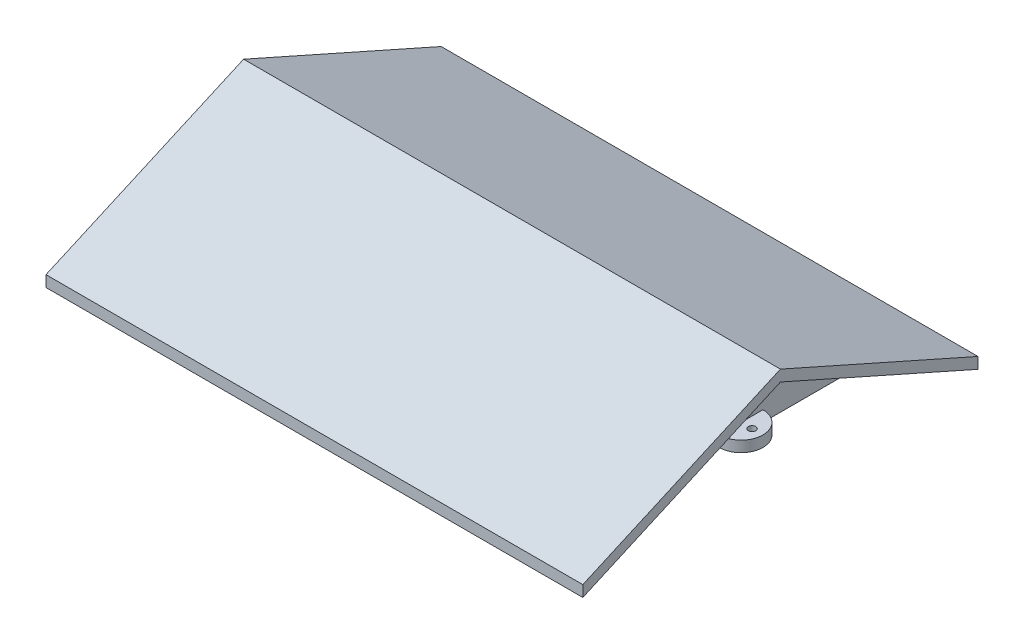
ISO-10303-21;
HEADER;
FILE_DESCRIPTION(('STEP AP214'),'2;1');
FILE_NAME('part.step','',(''),(''),'','','');
FILE_SCHEMA(('AUTOMOTIVE_DESIGN { 1 0 10303 214 1 1 1 1 }'));
ENDSEC;
DATA;
#1=APPLICATION_CONTEXT('core data for automotive mechanical design processes');
#2=APPLICATION_PROTOCOL_DEFINITION('international standard','automotive_design',2000,#1);
#3=PRODUCT_CONTEXT('',#1,'mechanical');
#4=PRODUCT('Part','Part','',(#3));
#5=PRODUCT_RELATED_PRODUCT_CATEGORY('part','',(#4));
#6=PRODUCT_DEFINITION_FORMATION('','',#4);
#7=PRODUCT_DEFINITION_CONTEXT('part definition',#1,'design');
#8=PRODUCT_DEFINITION('design','',#6,#7);
#9=PRODUCT_DEFINITION_SHAPE('','',#8);
#10=(LENGTH_UNIT() NAMED_UNIT(*) SI_UNIT(.MILLI.,.METRE.));
#11=(NAMED_UNIT(*) PLANE_ANGLE_UNIT() SI_UNIT($,.RADIAN.));
#12=(NAMED_UNIT(*) SI_UNIT($,.STERADIAN.) SOLID_ANGLE_UNIT());
#13=UNCERTAINTY_MEASURE_WITH_UNIT(LENGTH_MEASURE(1.E-05),#10,'distance_accuracy_value','');
#14=(GEOMETRIC_REPRESENTATION_CONTEXT(3) GLOBAL_UNCERTAINTY_ASSIGNED_CONTEXT((#13)) GLOBAL_UNIT_ASSIGNED_CONTEXT((#10,
#11,#12)) REPRESENTATION_CONTEXT('',''));
#15=CARTESIAN_POINT('',(0.,0.,0.));
#16=DIRECTION('',(0.,0.,1.));
#17=DIRECTION('',(1.,0.,0.));
#18=AXIS2_PLACEMENT_3D('',#15,#16,#17);
#19=CARTESIAN_POINT('',(0.0001,4.27585831422593,1.9003814729893));
#20=DIRECTION('',(0.,0.913811548620257,0.406138466053448));
#21=DIRECTION('',(0.,-0.406138466053448,0.913811548620257));
#22=AXIS2_PLACEMENT_3D('',#19,#20,#21);
#23=PLANE('',#22);
#24=DIRECTION('',(0.,-0.406138466053447,0.913811548620257));
#25=VECTOR('',#24,1.);
#26=CARTESIAN_POINT('',(-1.9999,-5.12047230222117,23.0421253599953));
#27=LINE('',#26,#25);
#28=CARTESIAN_POINT('',(-1.9999,35.1204723022212,-67.5));
#29=VERTEX_POINT('',#28);
#30=CARTESIAN_POINT('',(-1.9999,-5.12047230222117,23.0421253599953));
#31=VERTEX_POINT('',#30);
#32=EDGE_CURVE('E53',#29,#31,#27,.T.);
#33=ORIENTED_EDGE('',*,*,#32,.F.);
#34=DIRECTION('',(-1.,0.,0.));
#35=VECTOR('',#34,1.);
#36=CARTESIAN_POINT('',(0.0001,35.1204723022212,-67.5));
#37=LINE('',#36,#35);
#38=CARTESIAN_POINT('',(-248.,35.1204723022212,-67.5));
#39=VERTEX_POINT('',#38);
#40=EDGE_CURVE('E352',#29,#39,#37,.T.);
#41=ORIENTED_EDGE('',*,*,#40,.T.);
#42=DIRECTION('',(0.,0.406138466053448,-0.913811548620257));
#43=VECTOR('',#42,1.);
#44=CARTESIAN_POINT('',(-248.,4.27585831422593,1.9003814729893));
#45=LINE('',#44,#43);
#46=CARTESIAN_POINT('',(-248.,-5.12047230222117,23.0421253599953));
#47=VERTEX_POINT('',#46);
#48=EDGE_CURVE('E336',#47,#39,#45,.T.);
#49=ORIENTED_EDGE('',*,*,#48,.F.);
#50=DIRECTION('',(-1.,0.,0.));
#51=VECTOR('',#50,1.);
#52=CARTESIAN_POINT('',(0.0001,-5.12047230222117,23.0421253599953));
#53=LINE('',#52,#51);
#54=EDGE_CURVE('E201',#31,#47,#53,.T.);
#55=ORIENTED_EDGE('',*,*,#54,.F.);
#56=EDGE_LOOP('',(#33,#41,#49,#55));
#57=FACE_BOUND('',#56,.T.);
#58=ADVANCED_FACE('F39',(#57),#23,.T.);
#59=CARTESIAN_POINT('',(0.0001,0.,0.));
#60=DIRECTION('',(0.,-0.913811548620257,-0.406138466053447));
#61=DIRECTION('',(0.,0.406138466053448,-0.913811548620257));
#62=AXIS2_PLACEMENT_3D('',#59,#60,#61);
#63=PLANE('',#62);
#64=DIRECTION('',(0.,0.406138466053447,-0.913811548620257));
#65=VECTOR('',#64,1.);
#66=CARTESIAN_POINT('',(-1.9999,29.9999999999999,-67.5));
#67=LINE('',#66,#65);
#68=CARTESIAN_POINT('',(-1.9999,-10.2409446044423,23.0421253599953));
#69=VERTEX_POINT('',#68);
#70=CARTESIAN_POINT('',(-1.9999,29.9999999999999,-67.5));
#71=VERTEX_POINT('',#70);
#72=EDGE_CURVE('E181',#69,#71,#67,.T.);
#73=ORIENTED_EDGE('',*,*,#72,.F.);
#74=DIRECTION('',(-1.,0.,0.));
#75=VECTOR('',#74,1.);
#76=CARTESIAN_POINT('',(0.0001,-10.2409446044423,23.0421253599953));
#77=LINE('',#76,#75);
#78=CARTESIAN_POINT('',(-248.,-10.2409446044423,23.0421253599953));
#79=VERTEX_POINT('',#78);
#80=EDGE_CURVE('E191',#69,#79,#77,.T.);
#81=ORIENTED_EDGE('',*,*,#80,.T.);
#82=DIRECTION('',(0.,-0.406138466053448,0.913811548620257));
#83=VECTOR('',#82,1.);
#84=CARTESIAN_POINT('',(-248.,0.,0.));
#85=LINE('',#84,#83);
#86=CARTESIAN_POINT('',(-248.,0.,0.));
#87=VERTEX_POINT('',#86);
#88=EDGE_CURVE('E341',#87,#79,#85,.T.);
#89=ORIENTED_EDGE('',*,*,#88,.F.);
#90=DIRECTION('',(-1.,0.,0.));
#91=VECTOR('',#90,1.);
#92=CARTESIAN_POINT('',(-228.,0.,0.));
#93=LINE('',#92,#91);
#94=CARTESIAN_POINT('',(-228.,0.,0.));
#95=VERTEX_POINT('',#94);
#96=EDGE_CURVE('E296',#95,#87,#93,.T.);
#97=ORIENTED_EDGE('',*,*,#96,.F.);
#98=DIRECTION('',(-1.,0.,0.));
#99=VECTOR('',#98,1.);
#100=CARTESIAN_POINT('',(-223.,0.,0.));
#101=LINE('',#100,#99);
#102=CARTESIAN_POINT('',(-223.,0.,0.));
#103=VERTEX_POINT('',#102);
#104=EDGE_CURVE('E310',#103,#95,#101,.T.);
#105=ORIENTED_EDGE('',*,*,#104,.F.);
#106=DIRECTION('',(0.,0.406138466053448,-0.913811548620257));
#107=VECTOR('',#106,1.);
#108=CARTESIAN_POINT('',(-223.,0.,0.));
#109=LINE('',#108,#107);
#110=CARTESIAN_POINT('',(-223.,30.,-67.5));
#111=VERTEX_POINT('',#110);
#112=EDGE_CURVE('E306',#103,#111,#109,.T.);
#113=ORIENTED_EDGE('',*,*,#112,.T.);
#114=DIRECTION('',(-1.,0.,0.));
#115=VECTOR('',#114,1.);
#116=CARTESIAN_POINT('',(0.0001,30.,-67.5));
#117=LINE('',#116,#115);
#118=CARTESIAN_POINT('',(-24.9999,30.,-67.5));
#119=VERTEX_POINT('',#118);
#120=EDGE_CURVE('E202',#119,#111,#117,.T.);
#121=ORIENTED_EDGE('',*,*,#120,.F.);
#122=DIRECTION('',(0.,-0.406138466053448,0.913811548620257));
#123=VECTOR('',#122,1.);
#124=CARTESIAN_POINT('',(-24.9999,30.,-67.5));
#125=LINE('',#124,#123);
#126=CARTESIAN_POINT('',(-24.9999,0.,0.));
#127=VERTEX_POINT('',#126);
#128=EDGE_CURVE('E323',#119,#127,#125,.T.);
#129=ORIENTED_EDGE('',*,*,#128,.T.);
#130=DIRECTION('',(1.,0.,0.));
#131=VECTOR('',#130,1.);
#132=CARTESIAN_POINT('',(-24.9999,0.,0.));
#133=LINE('',#132,#131);
#134=CARTESIAN_POINT('',(-19.9999,0.,0.));
#135=VERTEX_POINT('',#134);
#136=EDGE_CURVE('E332',#127,#135,#133,.T.);
#137=ORIENTED_EDGE('',*,*,#136,.T.);
#138=DIRECTION('',(0.,-0.406138466053447,0.913811548620257));
#139=VECTOR('',#138,1.);
#140=CARTESIAN_POINT('',(-19.9999,29.9999999999999,-67.5));
#141=LINE('',#140,#139);
#142=CARTESIAN_POINT('',(-19.9999,29.9999999999999,-67.5));
#143=VERTEX_POINT('',#142);
#144=EDGE_CURVE('E313',#143,#135,#141,.T.);
#145=ORIENTED_EDGE('',*,*,#144,.F.);
#146=DIRECTION('',(1.,0.,0.));
#147=VECTOR('',#146,1.);
#148=CARTESIAN_POINT('',(-19.9999,29.9999999999999,-67.5));
#149=LINE('',#148,#147);
#150=EDGE_CURVE('E194',#143,#71,#149,.T.);
#151=ORIENTED_EDGE('',*,*,#150,.T.);
#152=EDGE_LOOP('',(#73,#81,#89,#97,#105,#113,#121,#129,#137,#145,#151));
#153=FACE_BOUND('',#152,.T.);
#154=ADVANCED_FACE('F189',(#153),#63,.T.);
#155=CARTESIAN_POINT('',(0.0001,50.1030927835052,-22.2680412371134));
#156=DIRECTION('',(0.,0.913811548620257,-0.406138466053447));
#157=DIRECTION('',(0.,0.406138466053448,0.913811548620257));
#158=AXIS2_PLACEMENT_3D('',#155,#156,#157);
#159=PLANE('',#158);
#160=DIRECTION('',(-1.,0.,0.));
#161=VECTOR('',#160,1.);
#162=CARTESIAN_POINT('',(0.0001,-10.2409446044423,-158.042125359995));
#163=LINE('',#162,#161);
#164=CARTESIAN_POINT('',(-1.9999,-10.2409446044423,-158.042125359995));
#165=VERTEX_POINT('',#164);
#166=CARTESIAN_POINT('',(-248.,-10.2409446044423,-158.042125359995));
#167=VERTEX_POINT('',#166);
#168=EDGE_CURVE('E207',#165,#167,#163,.T.);
#169=ORIENTED_EDGE('',*,*,#168,.F.);
#170=DIRECTION('',(0.,-0.406138466053447,-0.913811548620258));
#171=VECTOR('',#170,1.);
#172=CARTESIAN_POINT('',(-1.9999,-10.2409446044423,-158.042125359995));
#173=LINE('',#172,#171);
#174=EDGE_CURVE('E195',#71,#165,#173,.T.);
#175=ORIENTED_EDGE('',*,*,#174,.F.);
#176=ORIENTED_EDGE('',*,*,#150,.F.);
#177=DIRECTION('',(0.,0.406138466053447,0.913811548620257));
#178=VECTOR('',#177,1.);
#179=CARTESIAN_POINT('',(-19.9999,0.,-135.));
#180=LINE('',#179,#178);
#181=CARTESIAN_POINT('',(-19.9999,0.,-135.));
#182=VERTEX_POINT('',#181);
#183=EDGE_CURVE('E319',#182,#143,#180,.T.);
#184=ORIENTED_EDGE('',*,*,#183,.F.);
#185=DIRECTION('',(1.,0.,0.));
#186=VECTOR('',#185,1.);
#187=CARTESIAN_POINT('',(-24.9999,0.,-135.));
#188=LINE('',#187,#186);
#189=CARTESIAN_POINT('',(-24.9999,0.,-135.));
#190=VERTEX_POINT('',#189);
#191=EDGE_CURVE('E333',#190,#182,#188,.T.);
#192=ORIENTED_EDGE('',*,*,#191,.F.);
#193=DIRECTION('',(0.,0.406138466053448,0.913811548620257));
#194=VECTOR('',#193,1.);
#195=CARTESIAN_POINT('',(-24.9999,0.,-135.));
#196=LINE('',#195,#194);
#197=EDGE_CURVE('E329',#190,#119,#196,.T.);
#198=ORIENTED_EDGE('',*,*,#197,.T.);
#199=ORIENTED_EDGE('',*,*,#120,.T.);
#200=DIRECTION('',(0.,-0.406138466053448,-0.913811548620257));
#201=VECTOR('',#200,1.);
#202=CARTESIAN_POINT('',(-223.,30.,-67.5));
#203=LINE('',#202,#201);
#204=CARTESIAN_POINT('',(-223.,0.,-135.));
#205=VERTEX_POINT('',#204);
#206=EDGE_CURVE('E295',#111,#205,#203,.T.);
#207=ORIENTED_EDGE('',*,*,#206,.T.);
#208=DIRECTION('',(-1.,0.,0.));
#209=VECTOR('',#208,1.);
#210=CARTESIAN_POINT('',(-223.,0.,-135.));
#211=LINE('',#210,#209);
#212=CARTESIAN_POINT('',(-228.,0.,-135.));
#213=VERTEX_POINT('',#212);
#214=EDGE_CURVE('E309',#205,#213,#211,.T.);
#215=ORIENTED_EDGE('',*,*,#214,.T.);
#216=DIRECTION('',(-1.,0.,0.));
#217=VECTOR('',#216,1.);
#218=CARTESIAN_POINT('',(-228.,0.,-135.));
#219=LINE('',#218,#217);
#220=CARTESIAN_POINT('',(-248.,0.,-135.));
#221=VERTEX_POINT('',#220);
#222=EDGE_CURVE('E289',#213,#221,#219,.T.);
#223=ORIENTED_EDGE('',*,*,#222,.T.);
#224=DIRECTION('',(0.,-0.406138466053448,-0.913811548620257));
#225=VECTOR('',#224,1.);
#226=CARTESIAN_POINT('',(-248.,50.1030927835052,-22.2680412371134));
#227=LINE('',#226,#225);
#228=EDGE_CURVE('E343',#221,#167,#227,.T.);
#229=ORIENTED_EDGE('',*,*,#228,.T.);
#230=EDGE_LOOP('',(#169,#175,#176,#184,#192,#198,#199,#207,#215,#223,#229));
#231=FACE_BOUND('',#230,.T.);
#232=ADVANCED_FACE('F365',(#231),#159,.F.);
#233=CARTESIAN_POINT('',(0.0001,0.,-158.042125359995));
#234=DIRECTION('',(0.,0.,1.));
#235=DIRECTION('',(1.,0.,0.));
#236=AXIS2_PLACEMENT_3D('',#233,#234,#235);
#237=PLANE('',#236);
#238=DIRECTION('',(-1.,0.,0.));
#239=VECTOR('',#238,1.);
#240=CARTESIAN_POINT('',(0.0001,-5.12047230222117,-158.042125359995));
#241=LINE('',#240,#239);
#242=CARTESIAN_POINT('',(-1.9999,-5.12047230222117,-158.042125359995));
#243=VERTEX_POINT('',#242);
#244=CARTESIAN_POINT('',(-248.,-5.12047230222117,-158.042125359995));
#245=VERTEX_POINT('',#244);
#246=EDGE_CURVE('E354',#243,#245,#241,.T.);
#247=ORIENTED_EDGE('',*,*,#246,.F.);
#248=DIRECTION('',(0.,1.,0.));
#249=VECTOR('',#248,1.);
#250=CARTESIAN_POINT('',(-1.9999,-5.12047230222117,-158.042125359995));
#251=LINE('',#250,#249);
#252=EDGE_CURVE('E362',#165,#243,#251,.T.);
#253=ORIENTED_EDGE('',*,*,#252,.F.);
#254=ORIENTED_EDGE('',*,*,#168,.T.);
#255=DIRECTION('',(0.,1.,0.));
#256=VECTOR('',#255,1.);
#257=CARTESIAN_POINT('',(-248.,0.,-158.042125359995));
#258=LINE('',#257,#256);
#259=EDGE_CURVE('E346',#167,#245,#258,.T.);
#260=ORIENTED_EDGE('',*,*,#259,.T.);
#261=EDGE_LOOP('',(#247,#253,#254,#260));
#262=FACE_BOUND('',#261,.T.);
#263=ADVANCED_FACE('F359',(#262),#237,.F.);
#264=CARTESIAN_POINT('',(0.0001,54.3789510977311,-24.1684227101027));
#265=DIRECTION('',(0.,-0.913811548620257,0.406138466053448));
#266=DIRECTION('',(0.,-0.406138466053448,-0.913811548620257));
#267=AXIS2_PLACEMENT_3D('',#264,#265,#266);
#268=PLANE('',#267);
#269=ORIENTED_EDGE('',*,*,#40,.F.);
#270=DIRECTION('',(0.,0.406138466053448,0.913811548620257));
#271=VECTOR('',#270,1.);
#272=CARTESIAN_POINT('',(-1.9999,35.1204723022212,-67.5));
#273=LINE('',#272,#271);
#274=EDGE_CURVE('E375',#243,#29,#273,.T.);
#275=ORIENTED_EDGE('',*,*,#274,.F.);
#276=ORIENTED_EDGE('',*,*,#246,.T.);
#277=DIRECTION('',(0.,0.406138466053448,0.913811548620257));
#278=VECTOR('',#277,1.);
#279=CARTESIAN_POINT('',(-248.,54.3789510977311,-24.1684227101027));
#280=LINE('',#279,#278);
#281=EDGE_CURVE('E349',#245,#39,#280,.T.);
#282=ORIENTED_EDGE('',*,*,#281,.T.);
#283=EDGE_LOOP('',(#269,#275,#276,#282));
#284=FACE_BOUND('',#283,.T.);
#285=ADVANCED_FACE('F373',(#284),#268,.F.);
#286=CARTESIAN_POINT('',(-248.,0.,0.));
#287=DIRECTION('',(1.,0.,0.));
#288=DIRECTION('',(0.,0.,-1.));
#289=AXIS2_PLACEMENT_3D('',#286,#287,#288);
#290=PLANE('',#289);
#291=ORIENTED_EDGE('',*,*,#88,.T.);
#292=DIRECTION('',(0.,-1.,0.));
#293=VECTOR('',#292,1.);
#294=CARTESIAN_POINT('',(-248.,-10.2409446044423,23.0421253599953));
#295=LINE('',#294,#293);
#296=EDGE_CURVE('E199',#47,#79,#295,.T.);
#297=ORIENTED_EDGE('',*,*,#296,.F.);
#298=ORIENTED_EDGE('',*,*,#48,.T.);
#299=ORIENTED_EDGE('',*,*,#281,.F.);
#300=ORIENTED_EDGE('',*,*,#259,.F.);
#301=ORIENTED_EDGE('',*,*,#228,.F.);
#302=DIRECTION('',(0.,-0.401404468732289,-0.915900896648622));
#303=VECTOR('',#302,1.);
#304=CARTESIAN_POINT('',(-248.,29.5826783646268,-67.5));
#305=LINE('',#304,#303);
#306=CARTESIAN_POINT('',(-248.,29.5826783646268,-67.5));
#307=VERTEX_POINT('',#306);
#308=EDGE_CURVE('E279',#307,#221,#305,.T.);
#309=ORIENTED_EDGE('',*,*,#308,.F.);
#310=DIRECTION('',(0.,0.401404468732289,-0.915900896648622));
#311=VECTOR('',#310,1.);
#312=CARTESIAN_POINT('',(-248.,0.,0.));
#313=LINE('',#312,#311);
#314=EDGE_CURVE('E283',#87,#307,#313,.T.);
#315=ORIENTED_EDGE('',*,*,#314,.F.);
#316=EDGE_LOOP('',(#291,#297,#298,#299,#300,#301,#309,#315));
#317=FACE_BOUND('',#316,.T.);
#318=ADVANCED_FACE('F369',(#317),#290,.F.);
#319=CARTESIAN_POINT('',(-24.9999,0.,0.));
#320=DIRECTION('',(0.,-1.,0.));
#321=DIRECTION('',(0.,0.,-1.));
#322=AXIS2_PLACEMENT_3D('',#319,#320,#321);
#323=PLANE('',#322);
#324=DIRECTION('',(0.,0.,-1.));
#325=VECTOR('',#324,1.);
#326=CARTESIAN_POINT('',(-19.9999,0.,0.));
#327=LINE('',#326,#325);
#328=CARTESIAN_POINT('',(-19.9999,0.,-77.4999));
#329=VERTEX_POINT('',#328);
#330=EDGE_CURVE('E317',#329,#182,#327,.T.);
#331=ORIENTED_EDGE('',*,*,#330,.F.);
#332=CARTESIAN_POINT('',(-19.9999,0.,-67.5));
#333=DIRECTION('',(0.,-1.,0.));
#334=DIRECTION('',(0.,0.,-1.));
#335=AXIS2_PLACEMENT_3D('',#332,#333,#334);
#336=CIRCLE('',#335,9.9999);
#337=CARTESIAN_POINT('',(-19.9999,0.,-57.5001));
#338=VERTEX_POINT('',#337);
#339=EDGE_CURVE('E247',#329,#338,#336,.T.);
#340=ORIENTED_EDGE('',*,*,#339,.T.);
#341=EDGE_CURVE('E225',#135,#338,#327,.T.);
#342=ORIENTED_EDGE('',*,*,#341,.F.);
#343=ORIENTED_EDGE('',*,*,#136,.F.);
#344=DIRECTION('',(0.,0.,-1.));
#345=VECTOR('',#344,1.);
#346=CARTESIAN_POINT('',(-24.9999,0.,0.));
#347=LINE('',#346,#345);
#348=CARTESIAN_POINT('',(-24.9999,0.,-58.8398614324019));
#349=VERTEX_POINT('',#348);
#350=EDGE_CURVE('E327',#127,#349,#347,.T.);
#351=ORIENTED_EDGE('',*,*,#350,.T.);
#352=CARTESIAN_POINT('',(-24.9999,0.,-76.1601385675981));
#353=VERTEX_POINT('',#352);
#354=EDGE_CURVE('E61',#349,#353,#336,.T.);
#355=ORIENTED_EDGE('',*,*,#354,.T.);
#356=EDGE_CURVE('E326',#353,#190,#347,.T.);
#357=ORIENTED_EDGE('',*,*,#356,.T.);
#358=ORIENTED_EDGE('',*,*,#191,.T.);
#359=EDGE_LOOP('',(#331,#340,#342,#343,#351,#355,#357,#358));
#360=FACE_BOUND('',#359,.T.);
#361=CARTESIAN_POINT('',(-14.99995,0.,-67.5));
#362=DIRECTION('',(0.,-1.,0.));
#363=DIRECTION('',(0.,0.,-1.));
#364=AXIS2_PLACEMENT_3D('',#361,#362,#363);
#365=CIRCLE('',#364,1.7);
#366=CARTESIAN_POINT('',(-14.99995,0.,-69.2));
#367=VERTEX_POINT('',#366);
#368=EDGE_CURVE('E242',#367,#367,#365,.T.);
#369=ORIENTED_EDGE('',*,*,#368,.F.);
#370=EDGE_LOOP('',(#369));
#371=FACE_BOUND('',#370,.T.);
#372=ADVANCED_FACE('F446',(#360,#371),#323,.T.);
#373=CARTESIAN_POINT('',(-24.9999,0.,0.));
#374=DIRECTION('',(-1.,0.,0.));
#375=DIRECTION('',(0.,0.,1.));
#376=AXIS2_PLACEMENT_3D('',#373,#374,#375);
#377=PLANE('',#376);
#378=DIRECTION('',(0.,-1.,0.));
#379=VECTOR('',#378,1.);
#380=CARTESIAN_POINT('',(-24.9999,5.00000000000001,-76.1601385675981));
#381=LINE('',#380,#379);
#382=CARTESIAN_POINT('',(-24.9999,5.00000000000001,-76.1601385675981));
#383=VERTEX_POINT('',#382);
#384=EDGE_CURVE('E255',#383,#353,#381,.T.);
#385=ORIENTED_EDGE('',*,*,#384,.F.);
#386=DIRECTION('',(0.,0.,1.));
#387=VECTOR('',#386,1.);
#388=CARTESIAN_POINT('',(-24.9999,5.,0.));
#389=LINE('',#388,#387);
#390=CARTESIAN_POINT('',(-24.9999,5.,-58.8398614324019));
#391=VERTEX_POINT('',#390);
#392=EDGE_CURVE('E239',#383,#391,#389,.T.);
#393=ORIENTED_EDGE('',*,*,#392,.T.);
#394=DIRECTION('',(0.,-1.,0.));
#395=VECTOR('',#394,1.);
#396=CARTESIAN_POINT('',(-24.9999,5.,-58.8398614324019));
#397=LINE('',#396,#395);
#398=EDGE_CURVE('E253',#349,#391,#397,.F.);
#399=ORIENTED_EDGE('',*,*,#398,.F.);
#400=ORIENTED_EDGE('',*,*,#350,.F.);
#401=ORIENTED_EDGE('',*,*,#128,.F.);
#402=ORIENTED_EDGE('',*,*,#197,.F.);
#403=ORIENTED_EDGE('',*,*,#356,.F.);
#404=EDGE_LOOP('',(#385,#393,#399,#400,#401,#402,#403));
#405=FACE_BOUND('',#404,.T.);
#406=ADVANCED_FACE('F443',(#405),#377,.T.);
#407=CARTESIAN_POINT('',(-19.9999,0.,0.));
#408=DIRECTION('',(-1.,0.,0.));
#409=DIRECTION('',(0.,0.,1.));
#410=AXIS2_PLACEMENT_3D('',#407,#408,#409);
#411=PLANE('',#410);
#412=DIRECTION('',(0.,0.,1.));
#413=VECTOR('',#412,1.);
#414=CARTESIAN_POINT('',(-19.9999,5.,0.));
#415=LINE('',#414,#413);
#416=CARTESIAN_POINT('',(-19.9999,5.00000000000001,-77.4999));
#417=VERTEX_POINT('',#416);
#418=CARTESIAN_POINT('',(-19.9999,5.,-57.5001));
#419=VERTEX_POINT('',#418);
#420=EDGE_CURVE('E218',#417,#419,#415,.T.);
#421=ORIENTED_EDGE('',*,*,#420,.F.);
#422=DIRECTION('',(0.,-1.,0.));
#423=VECTOR('',#422,1.);
#424=CARTESIAN_POINT('',(-19.9999,5.00000000000001,-77.4999));
#425=LINE('',#424,#423);
#426=EDGE_CURVE('E11',#417,#329,#425,.T.);
#427=ORIENTED_EDGE('',*,*,#426,.T.);
#428=ORIENTED_EDGE('',*,*,#330,.T.);
#429=ORIENTED_EDGE('',*,*,#183,.T.);
#430=ORIENTED_EDGE('',*,*,#144,.T.);
#431=ORIENTED_EDGE('',*,*,#341,.T.);
#432=DIRECTION('',(0.,-1.,0.));
#433=VECTOR('',#432,1.);
#434=CARTESIAN_POINT('',(-19.9999,5.,-57.5001));
#435=LINE('',#434,#433);
#436=EDGE_CURVE('E46',#338,#419,#435,.F.);
#437=ORIENTED_EDGE('',*,*,#436,.T.);
#438=EDGE_LOOP('',(#421,#427,#428,#429,#430,#431,#437));
#439=FACE_BOUND('',#438,.T.);
#440=ADVANCED_FACE('F222',(#439),#411,.F.);
#441=CARTESIAN_POINT('',(-223.,0.,-135.));
#442=DIRECTION('',(0.,-1.,0.));
#443=DIRECTION('',(0.,0.,-1.));
#444=AXIS2_PLACEMENT_3D('',#441,#442,#443);
#445=PLANE('',#444);
#446=DIRECTION('',(0.,0.,1.));
#447=VECTOR('',#446,1.);
#448=CARTESIAN_POINT('',(-228.,0.,-135.));
#449=LINE('',#448,#447);
#450=CARTESIAN_POINT('',(-228.,0.,-53.5));
#451=VERTEX_POINT('',#450);
#452=EDGE_CURVE('E282',#451,#95,#449,.T.);
#453=ORIENTED_EDGE('',*,*,#452,.F.);
#454=CARTESIAN_POINT('',(-228.,0.,-67.5));
#455=DIRECTION('',(0.,-1.,0.));
#456=DIRECTION('',(0.,0.,-1.));
#457=AXIS2_PLACEMENT_3D('',#454,#455,#456);
#458=CIRCLE('',#457,14.);
#459=CARTESIAN_POINT('',(-228.,0.,-81.5));
#460=VERTEX_POINT('',#459);
#461=EDGE_CURVE('E257',#451,#460,#458,.T.);
#462=ORIENTED_EDGE('',*,*,#461,.T.);
#463=EDGE_CURVE('E284',#213,#460,#449,.T.);
#464=ORIENTED_EDGE('',*,*,#463,.F.);
#465=ORIENTED_EDGE('',*,*,#214,.F.);
#466=DIRECTION('',(0.,0.,1.));
#467=VECTOR('',#466,1.);
#468=CARTESIAN_POINT('',(-223.,0.,-135.));
#469=LINE('',#468,#467);
#470=CARTESIAN_POINT('',(-223.,0.,-80.576696830622));
#471=VERTEX_POINT('',#470);
#472=EDGE_CURVE('E303',#205,#471,#469,.T.);
#473=ORIENTED_EDGE('',*,*,#472,.T.);
#474=CARTESIAN_POINT('',(-223.,0.,-54.423303169378));
#475=VERTEX_POINT('',#474);
#476=EDGE_CURVE('E269',#471,#475,#458,.T.);
#477=ORIENTED_EDGE('',*,*,#476,.T.);
#478=EDGE_CURVE('E302',#475,#103,#469,.T.);
#479=ORIENTED_EDGE('',*,*,#478,.T.);
#480=ORIENTED_EDGE('',*,*,#104,.T.);
#481=EDGE_LOOP('',(#453,#462,#464,#465,#473,#477,#479,#480));
#482=FACE_BOUND('',#481,.T.);
#483=CARTESIAN_POINT('',(-235.,0.,-67.5));
#484=DIRECTION('',(0.,-1.,0.));
#485=DIRECTION('',(0.,0.,-1.));
#486=AXIS2_PLACEMENT_3D('',#483,#484,#485);
#487=CIRCLE('',#486,1.70000000000001);
#488=CARTESIAN_POINT('',(-235.,0.,-69.2));
#489=VERTEX_POINT('',#488);
#490=EDGE_CURVE('E262',#489,#489,#487,.T.);
#491=ORIENTED_EDGE('',*,*,#490,.F.);
#492=EDGE_LOOP('',(#491));
#493=FACE_BOUND('',#492,.T.);
#494=ADVANCED_FACE('F394',(#482,#493),#445,.T.);
#495=CARTESIAN_POINT('',(-223.,0.,0.));
#496=DIRECTION('',(1.,0.,0.));
#497=DIRECTION('',(0.,0.,-1.));
#498=AXIS2_PLACEMENT_3D('',#495,#496,#497);
#499=PLANE('',#498);
#500=CARTESIAN_POINT('',(-223.,25.,-67.5));
#501=DIRECTION('',(1.,0.,0.));
#502=DIRECTION('',(0.,0.,-1.));
#503=AXIS2_PLACEMENT_3D('',#500,#501,#502);
#504=CIRCLE('',#503,1.5);
#505=CARTESIAN_POINT('',(-223.,25.,-69.));
#506=VERTEX_POINT('',#505);
#507=EDGE_CURVE('E244',#506,#506,#504,.T.);
#508=ORIENTED_EDGE('',*,*,#507,.F.);
#509=EDGE_LOOP('',(#508));
#510=FACE_BOUND('',#509,.T.);
#511=DIRECTION('',(0.,-1.,0.));
#512=VECTOR('',#511,1.);
#513=CARTESIAN_POINT('',(-223.,5.,-54.423303169378));
#514=LINE('',#513,#512);
#515=CARTESIAN_POINT('',(-223.,5.,-54.423303169378));
#516=VERTEX_POINT('',#515);
#517=EDGE_CURVE('E276',#516,#475,#514,.T.);
#518=ORIENTED_EDGE('',*,*,#517,.F.);
#519=DIRECTION('',(0.,0.,-1.));
#520=VECTOR('',#519,1.);
#521=CARTESIAN_POINT('',(-223.,5.,0.));
#522=LINE('',#521,#520);
#523=CARTESIAN_POINT('',(-223.,5.00000000000001,-80.576696830622));
#524=VERTEX_POINT('',#523);
#525=EDGE_CURVE('E266',#516,#524,#522,.T.);
#526=ORIENTED_EDGE('',*,*,#525,.T.);
#527=DIRECTION('',(0.,-1.,0.));
#528=VECTOR('',#527,1.);
#529=CARTESIAN_POINT('',(-223.,5.00000000000001,-80.576696830622));
#530=LINE('',#529,#528);
#531=EDGE_CURVE('E274',#471,#524,#530,.F.);
#532=ORIENTED_EDGE('',*,*,#531,.F.);
#533=ORIENTED_EDGE('',*,*,#472,.F.);
#534=ORIENTED_EDGE('',*,*,#206,.F.);
#535=ORIENTED_EDGE('',*,*,#112,.F.);
#536=ORIENTED_EDGE('',*,*,#478,.F.);
#537=EDGE_LOOP('',(#518,#526,#532,#533,#534,#535,#536));
#538=FACE_BOUND('',#537,.T.);
#539=ADVANCED_FACE('F390',(#510,#538),#499,.T.);
#540=CARTESIAN_POINT('',(-228.,29.5826783646268,-67.5));
#541=DIRECTION('',(0.,0.915900896648622,-0.401404468732289));
#542=DIRECTION('',(0.,0.401404468732289,0.915900896648622));
#543=AXIS2_PLACEMENT_3D('',#540,#541,#542);
#544=PLANE('',#543);
#545=ORIENTED_EDGE('',*,*,#308,.T.);
#546=ORIENTED_EDGE('',*,*,#222,.F.);
#547=DIRECTION('',(0.,-0.401404468732289,-0.915900896648622));
#548=VECTOR('',#547,1.);
#549=CARTESIAN_POINT('',(-228.,29.5826783646268,-67.5));
#550=LINE('',#549,#548);
#551=CARTESIAN_POINT('',(-228.,29.5826783646268,-67.5));
#552=VERTEX_POINT('',#551);
#553=EDGE_CURVE('E280',#552,#213,#550,.T.);
#554=ORIENTED_EDGE('',*,*,#553,.F.);
#555=DIRECTION('',(-1.,0.,0.));
#556=VECTOR('',#555,1.);
#557=CARTESIAN_POINT('',(-228.,29.5826783646268,-67.5));
#558=LINE('',#557,#556);
#559=EDGE_CURVE('E293',#552,#307,#558,.T.);
#560=ORIENTED_EDGE('',*,*,#559,.T.);
#561=EDGE_LOOP('',(#545,#546,#554,#560));
#562=FACE_BOUND('',#561,.T.);
#563=ADVANCED_FACE('F393',(#562),#544,.F.);
#564=CARTESIAN_POINT('',(-228.,0.,0.));
#565=DIRECTION('',(0.,0.915900896648622,0.401404468732289));
#566=DIRECTION('',(0.,-0.401404468732289,0.915900896648622));
#567=AXIS2_PLACEMENT_3D('',#564,#565,#566);
#568=PLANE('',#567);
#569=ORIENTED_EDGE('',*,*,#314,.T.);
#570=ORIENTED_EDGE('',*,*,#559,.F.);
#571=DIRECTION('',(0.,0.401404468732289,-0.915900896648622));
#572=VECTOR('',#571,1.);
#573=CARTESIAN_POINT('',(-228.,0.,0.));
#574=LINE('',#573,#572);
#575=EDGE_CURVE('E286',#95,#552,#574,.T.);
#576=ORIENTED_EDGE('',*,*,#575,.F.);
#577=ORIENTED_EDGE('',*,*,#96,.T.);
#578=EDGE_LOOP('',(#569,#570,#576,#577));
#579=FACE_BOUND('',#578,.T.);
#580=ADVANCED_FACE('F550',(#579),#568,.F.);
#581=CARTESIAN_POINT('',(-228.,0.,0.));
#582=DIRECTION('',(1.,0.,0.));
#583=DIRECTION('',(0.,0.,-1.));
#584=AXIS2_PLACEMENT_3D('',#581,#582,#583);
#585=PLANE('',#584);
#586=CARTESIAN_POINT('',(-228.,25.,-67.5));
#587=DIRECTION('',(-1.,0.,0.));
#588=DIRECTION('',(0.,0.,1.));
#589=AXIS2_PLACEMENT_3D('',#586,#587,#588);
#590=CIRCLE('',#589,1.5);
#591=CARTESIAN_POINT('',(-228.,25.,-66.));
#592=VERTEX_POINT('',#591);
#593=EDGE_CURVE('E381',#592,#592,#590,.T.);
#594=ORIENTED_EDGE('',*,*,#593,.F.);
#595=EDGE_LOOP('',(#594));
#596=FACE_BOUND('',#595,.T.);
#597=DIRECTION('',(0.,0.,-1.));
#598=VECTOR('',#597,1.);
#599=CARTESIAN_POINT('',(-228.,5.,0.));
#600=LINE('',#599,#598);
#601=CARTESIAN_POINT('',(-228.,5.,-53.5));
#602=VERTEX_POINT('',#601);
#603=CARTESIAN_POINT('',(-228.,5.00000000000001,-81.5));
#604=VERTEX_POINT('',#603);
#605=EDGE_CURVE('E204',#602,#604,#600,.T.);
#606=ORIENTED_EDGE('',*,*,#605,.F.);
#607=DIRECTION('',(0.,-1.,0.));
#608=VECTOR('',#607,1.);
#609=CARTESIAN_POINT('',(-228.,5.,-53.5));
#610=LINE('',#609,#608);
#611=EDGE_CURVE('E215',#602,#451,#610,.T.);
#612=ORIENTED_EDGE('',*,*,#611,.T.);
#613=ORIENTED_EDGE('',*,*,#452,.T.);
#614=ORIENTED_EDGE('',*,*,#575,.T.);
#615=ORIENTED_EDGE('',*,*,#553,.T.);
#616=ORIENTED_EDGE('',*,*,#463,.T.);
#617=DIRECTION('',(0.,-1.,0.));
#618=VECTOR('',#617,1.);
#619=CARTESIAN_POINT('',(-228.,5.00000000000001,-81.5));
#620=LINE('',#619,#618);
#621=EDGE_CURVE('E213',#460,#604,#620,.F.);
#622=ORIENTED_EDGE('',*,*,#621,.T.);
#623=EDGE_LOOP('',(#606,#612,#613,#614,#615,#616,#622));
#624=FACE_BOUND('',#623,.T.);
#625=ADVANCED_FACE('F558',(#596,#624),#585,.F.);
#626=CARTESIAN_POINT('',(-235.,5.00000000000001,-67.5));
#627=DIRECTION('',(0.,-1.,0.));
#628=DIRECTION('',(0.,0.,-1.));
#629=AXIS2_PLACEMENT_3D('',#626,#627,#628);
#630=CYLINDRICAL_SURFACE('',#629,1.70000000000001);
#631=CARTESIAN_POINT('',(-235.,5.00000000000001,-67.5));
#632=DIRECTION('',(0.,-1.,0.));
#633=DIRECTION('',(0.,0.,-1.));
#634=AXIS2_PLACEMENT_3D('',#631,#632,#633);
#635=CIRCLE('',#634,1.70000000000001);
#636=CARTESIAN_POINT('',(-235.,5.00000000000001,-69.2));
#637=VERTEX_POINT('',#636);
#638=EDGE_CURVE('E263',#637,#637,#635,.T.);
#639=ORIENTED_EDGE('',*,*,#638,.F.);
#640=EDGE_LOOP('',(#639));
#641=FACE_BOUND('',#640,.T.);
#642=ORIENTED_EDGE('',*,*,#490,.T.);
#643=EDGE_LOOP('',(#642));
#644=FACE_BOUND('',#643,.T.);
#645=ADVANCED_FACE('F421',(#641,#644),#630,.F.);
#646=CARTESIAN_POINT('',(0.,5.,0.));
#647=DIRECTION('',(0.,-1.,0.));
#648=DIRECTION('',(0.,0.,-1.));
#649=AXIS2_PLACEMENT_3D('',#646,#647,#648);
#650=PLANE('',#649);
#651=ORIENTED_EDGE('',*,*,#638,.T.);
#652=EDGE_LOOP('',(#651));
#653=FACE_BOUND('',#652,.T.);
#654=CARTESIAN_POINT('',(-228.,5.00000000000001,-67.5));
#655=DIRECTION('',(0.,-1.,0.));
#656=DIRECTION('',(0.,0.,-1.));
#657=AXIS2_PLACEMENT_3D('',#654,#655,#656);
#658=CIRCLE('',#657,14.);
#659=EDGE_CURVE('E258',#602,#604,#658,.T.);
#660=ORIENTED_EDGE('',*,*,#659,.F.);
#661=ORIENTED_EDGE('',*,*,#605,.T.);
#662=EDGE_LOOP('',(#660,#661));
#663=FACE_BOUND('',#662,.T.);
#664=ADVANCED_FACE('F409',(#653,#663),#650,.F.);
#665=CARTESIAN_POINT('',(-228.,5.00000000000001,-67.5));
#666=DIRECTION('',(0.,-1.,0.));
#667=DIRECTION('',(0.,0.,-1.));
#668=AXIS2_PLACEMENT_3D('',#665,#666,#667);
#669=CYLINDRICAL_SURFACE('',#668,14.);
#670=ORIENTED_EDGE('',*,*,#611,.F.);
#671=ORIENTED_EDGE('',*,*,#659,.T.);
#672=ORIENTED_EDGE('',*,*,#621,.F.);
#673=ORIENTED_EDGE('',*,*,#461,.F.);
#674=EDGE_LOOP('',(#670,#671,#672,#673));
#675=FACE_BOUND('',#674,.T.);
#676=ADVANCED_FACE('F416',(#675),#669,.T.);
#677=EDGE_CURVE('E261',#524,#516,#658,.T.);
#678=ORIENTED_EDGE('',*,*,#677,.T.);
#679=ORIENTED_EDGE('',*,*,#517,.T.);
#680=ORIENTED_EDGE('',*,*,#476,.F.);
#681=ORIENTED_EDGE('',*,*,#531,.T.);
#682=EDGE_LOOP('',(#678,#679,#680,#681));
#683=FACE_BOUND('',#682,.T.);
#684=ADVANCED_FACE('F402',(#683),#669,.T.);
#685=ORIENTED_EDGE('',*,*,#525,.F.);
#686=ORIENTED_EDGE('',*,*,#677,.F.);
#687=EDGE_LOOP('',(#685,#686));
#688=FACE_BOUND('',#687,.T.);
#689=ADVANCED_FACE('F405',(#688),#650,.F.);
#690=CARTESIAN_POINT('',(-14.99995,5.,-67.5));
#691=DIRECTION('',(0.,-1.,0.));
#692=DIRECTION('',(0.,0.,-1.));
#693=AXIS2_PLACEMENT_3D('',#690,#691,#692);
#694=CYLINDRICAL_SURFACE('',#693,1.7);
#695=CARTESIAN_POINT('',(-14.99995,5.,-67.5));
#696=DIRECTION('',(0.,-1.,0.));
#697=DIRECTION('',(0.,0.,-1.));
#698=AXIS2_PLACEMENT_3D('',#695,#696,#697);
#699=CIRCLE('',#698,1.7);
#700=CARTESIAN_POINT('',(-14.99995,5.,-69.2));
#701=VERTEX_POINT('',#700);
#702=EDGE_CURVE('E235',#701,#701,#699,.T.);
#703=ORIENTED_EDGE('',*,*,#702,.F.);
#704=EDGE_LOOP('',(#703));
#705=FACE_BOUND('',#704,.T.);
#706=ORIENTED_EDGE('',*,*,#368,.T.);
#707=EDGE_LOOP('',(#706));
#708=FACE_BOUND('',#707,.T.);
#709=ADVANCED_FACE('F407',(#705,#708),#694,.F.);
#710=CARTESIAN_POINT('',(0.,5.,0.));
#711=DIRECTION('',(0.,-1.,0.));
#712=DIRECTION('',(0.,0.,-1.));
#713=AXIS2_PLACEMENT_3D('',#710,#711,#712);
#714=PLANE('',#713);
#715=ORIENTED_EDGE('',*,*,#702,.T.);
#716=EDGE_LOOP('',(#715));
#717=FACE_BOUND('',#716,.T.);
#718=CARTESIAN_POINT('',(-19.9999,5.,-67.5));
#719=DIRECTION('',(0.,-1.,0.));
#720=DIRECTION('',(0.,0.,-1.));
#721=AXIS2_PLACEMENT_3D('',#718,#719,#720);
#722=CIRCLE('',#721,9.9999);
#723=EDGE_CURVE('E233',#417,#419,#722,.T.);
#724=ORIENTED_EDGE('',*,*,#723,.F.);
#725=ORIENTED_EDGE('',*,*,#420,.T.);
#726=EDGE_LOOP('',(#724,#725));
#727=FACE_BOUND('',#726,.T.);
#728=ADVANCED_FACE('F232',(#717,#727),#714,.F.);
#729=CARTESIAN_POINT('',(-19.9999,5.,-67.5));
#730=DIRECTION('',(0.,-1.,0.));
#731=DIRECTION('',(0.,0.,-1.));
#732=AXIS2_PLACEMENT_3D('',#729,#730,#731);
#733=CYLINDRICAL_SURFACE('',#732,9.9999);
#734=ORIENTED_EDGE('',*,*,#426,.F.);
#735=ORIENTED_EDGE('',*,*,#723,.T.);
#736=ORIENTED_EDGE('',*,*,#436,.F.);
#737=ORIENTED_EDGE('',*,*,#339,.F.);
#738=EDGE_LOOP('',(#734,#735,#736,#737));
#739=FACE_BOUND('',#738,.T.);
#740=ADVANCED_FACE('F234',(#739),#733,.T.);
#741=EDGE_CURVE('E236',#391,#383,#722,.T.);
#742=ORIENTED_EDGE('',*,*,#741,.T.);
#743=ORIENTED_EDGE('',*,*,#384,.T.);
#744=ORIENTED_EDGE('',*,*,#354,.F.);
#745=ORIENTED_EDGE('',*,*,#398,.T.);
#746=EDGE_LOOP('',(#742,#743,#744,#745));
#747=FACE_BOUND('',#746,.T.);
#748=ADVANCED_FACE('F665',(#747),#733,.T.);
#749=ORIENTED_EDGE('',*,*,#392,.F.);
#750=ORIENTED_EDGE('',*,*,#741,.F.);
#751=EDGE_LOOP('',(#749,#750));
#752=FACE_BOUND('',#751,.T.);
#753=ADVANCED_FACE('F649',(#752),#714,.F.);
#754=CARTESIAN_POINT('',(-218.,25.,-67.5));
#755=DIRECTION('',(-1.,0.,0.));
#756=DIRECTION('',(0.,0.,1.));
#757=AXIS2_PLACEMENT_3D('',#754,#755,#756);
#758=CYLINDRICAL_SURFACE('',#757,1.5);
#759=ORIENTED_EDGE('',*,*,#507,.T.);
#760=EDGE_LOOP('',(#759));
#761=FACE_BOUND('',#760,.T.);
#762=ORIENTED_EDGE('',*,*,#593,.T.);
#763=EDGE_LOOP('',(#762));
#764=FACE_BOUND('',#763,.T.);
#765=ADVANCED_FACE('F388',(#761,#764),#758,.F.);
#766=CARTESIAN_POINT('',(2.,-10.2409446044423,23.0421253599953));
#767=DIRECTION('',(0.,0.,-1.));
#768=DIRECTION('',(-1.,0.,0.));
#769=AXIS2_PLACEMENT_3D('',#766,#767,#768);
#770=PLANE('',#769);
#771=ORIENTED_EDGE('',*,*,#80,.F.);
#772=DIRECTION('',(0.,-1.,0.));
#773=VECTOR('',#772,1.);
#774=CARTESIAN_POINT('',(-1.9999,-10.2409446044423,23.0421253599953));
#775=LINE('',#774,#773);
#776=EDGE_CURVE('E178',#31,#69,#775,.T.);
#777=ORIENTED_EDGE('',*,*,#776,.F.);
#778=ORIENTED_EDGE('',*,*,#54,.T.);
#779=ORIENTED_EDGE('',*,*,#296,.T.);
#780=EDGE_LOOP('',(#771,#777,#778,#779));
#781=FACE_BOUND('',#780,.T.);
#782=ADVANCED_FACE('F197',(#781),#770,.F.);
#783=CARTESIAN_POINT('',(-1.9999,0.,0.));
#784=DIRECTION('',(-1.,0.,0.));
#785=DIRECTION('',(0.,0.,1.));
#786=AXIS2_PLACEMENT_3D('',#783,#784,#785);
#787=PLANE('',#786);
#788=ORIENTED_EDGE('',*,*,#776,.T.);
#789=ORIENTED_EDGE('',*,*,#72,.T.);
#790=ORIENTED_EDGE('',*,*,#174,.T.);
#791=ORIENTED_EDGE('',*,*,#252,.T.);
#792=ORIENTED_EDGE('',*,*,#274,.T.);
#793=ORIENTED_EDGE('',*,*,#32,.T.);
#794=EDGE_LOOP('',(#788,#789,#790,#791,#792,#793));
#795=FACE_BOUND('',#794,.T.);
#796=ADVANCED_FACE('F180',(#795),#787,.F.);
#797=CLOSED_SHELL('',(#58,#154,#232,#263,#285,#318,#372,#406,#440,#494,#539,#563,#580,#625,#645,
#664,#676,#684,#689,#709,#728,#740,#748,#753,#765,#782,#796));
#798=MANIFOLD_SOLID_BREP('B2',#797);
#799=ADVANCED_BREP_SHAPE_REPRESENTATION('',(#18,#798),#14);
#800=SHAPE_DEFINITION_REPRESENTATION(#9,#799);
ENDSEC;
END-ISO-10303-21;
